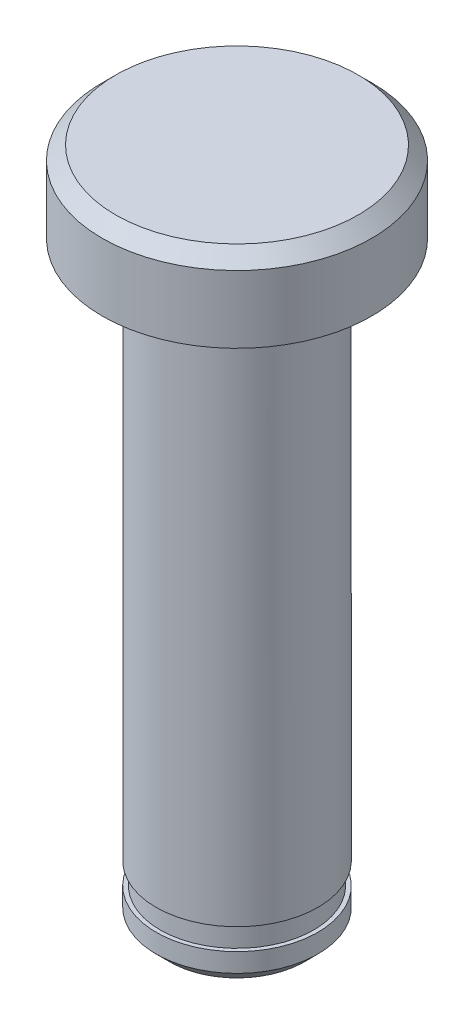
ISO-10303-21;
HEADER;
FILE_DESCRIPTION(('STEP AP214'),'2;1');
FILE_NAME('part.step','',(''),(''),'','','');
FILE_SCHEMA(('AUTOMOTIVE_DESIGN { 1 0 10303 214 1 1 1 1 }'));
ENDSEC;
DATA;
#1=APPLICATION_CONTEXT('core data for automotive mechanical design processes');
#2=APPLICATION_PROTOCOL_DEFINITION('international standard','automotive_design',2000,#1);
#3=PRODUCT_CONTEXT('',#1,'mechanical');
#4=PRODUCT('Part','Part','',(#3));
#5=PRODUCT_RELATED_PRODUCT_CATEGORY('part','',(#4));
#6=PRODUCT_DEFINITION_FORMATION('','',#4);
#7=PRODUCT_DEFINITION_CONTEXT('part definition',#1,'design');
#8=PRODUCT_DEFINITION('design','',#6,#7);
#9=PRODUCT_DEFINITION_SHAPE('','',#8);
#10=(LENGTH_UNIT() NAMED_UNIT(*) SI_UNIT(.MILLI.,.METRE.));
#11=(NAMED_UNIT(*) PLANE_ANGLE_UNIT() SI_UNIT($,.RADIAN.));
#12=(NAMED_UNIT(*) SI_UNIT($,.STERADIAN.) SOLID_ANGLE_UNIT());
#13=UNCERTAINTY_MEASURE_WITH_UNIT(LENGTH_MEASURE(1.E-05),#10,'distance_accuracy_value','');
#14=(GEOMETRIC_REPRESENTATION_CONTEXT(3) GLOBAL_UNCERTAINTY_ASSIGNED_CONTEXT((#13)) GLOBAL_UNIT_ASSIGNED_CONTEXT((#10,
#11,#12)) REPRESENTATION_CONTEXT('',''));
#15=CARTESIAN_POINT('',(0.,0.,0.));
#16=DIRECTION('',(0.,0.,1.));
#17=DIRECTION('',(1.,0.,0.));
#18=AXIS2_PLACEMENT_3D('',#15,#16,#17);
#19=CARTESIAN_POINT('',(0.,3.,0.));
#20=DIRECTION('',(0.,-1.,0.));
#21=DIRECTION('',(0.,0.,-1.));
#22=AXIS2_PLACEMENT_3D('',#19,#20,#21);
#23=CYLINDRICAL_SURFACE('',#22,5.);
#24=CARTESIAN_POINT('',(0.,2.5,0.));
#25=DIRECTION('',(0.,1.,0.));
#26=DIRECTION('',(0.,0.,1.));
#27=AXIS2_PLACEMENT_3D('',#24,#25,#26);
#28=CIRCLE('',#27,5.);
#29=CARTESIAN_POINT('',(0.,2.5,5.));
#30=VERTEX_POINT('',#29);
#31=EDGE_CURVE('E73',#30,#30,#28,.F.);
#32=ORIENTED_EDGE('',*,*,#31,.T.);
#33=EDGE_LOOP('',(#32));
#34=FACE_BOUND('',#33,.T.);
#35=CARTESIAN_POINT('',(0.,0.,0.));
#36=DIRECTION('',(0.,1.,0.));
#37=DIRECTION('',(0.,0.,1.));
#38=AXIS2_PLACEMENT_3D('',#35,#36,#37);
#39=CIRCLE('',#38,5.);
#40=CARTESIAN_POINT('',(0.,0.,5.));
#41=VERTEX_POINT('',#40);
#42=EDGE_CURVE('E62',#41,#41,#39,.T.);
#43=ORIENTED_EDGE('',*,*,#42,.T.);
#44=EDGE_LOOP('',(#43));
#45=FACE_BOUND('',#44,.T.);
#46=ADVANCED_FACE('F39',(#34,#45),#23,.T.);
#47=CARTESIAN_POINT('',(0.,3.,0.));
#48=DIRECTION('',(0.,1.,0.));
#49=DIRECTION('',(0.,0.,1.));
#50=AXIS2_PLACEMENT_3D('',#47,#48,#49);
#51=PLANE('',#50);
#52=CARTESIAN_POINT('',(0.,3.,0.));
#53=DIRECTION('',(0.,1.,0.));
#54=DIRECTION('',(0.,0.,1.));
#55=AXIS2_PLACEMENT_3D('',#52,#53,#54);
#56=CIRCLE('',#55,4.5);
#57=CARTESIAN_POINT('',(0.,3.,4.5));
#58=VERTEX_POINT('',#57);
#59=EDGE_CURVE('E76',#58,#58,#56,.T.);
#60=ORIENTED_EDGE('',*,*,#59,.T.);
#61=EDGE_LOOP('',(#60));
#62=FACE_BOUND('',#61,.T.);
#63=ADVANCED_FACE('F90',(#62),#51,.T.);
#64=CARTESIAN_POINT('',(0.,0.,0.));
#65=DIRECTION('',(0.,1.,0.));
#66=DIRECTION('',(0.,0.,1.));
#67=AXIS2_PLACEMENT_3D('',#64,#65,#66);
#68=PLANE('',#67);
#69=CARTESIAN_POINT('',(0.,0.,0.));
#70=DIRECTION('',(0.,-1.,0.));
#71=DIRECTION('',(0.,0.,-1.));
#72=AXIS2_PLACEMENT_3D('',#69,#70,#71);
#73=CIRCLE('',#72,3.);
#74=CARTESIAN_POINT('',(0.,0.,-3.));
#75=VERTEX_POINT('',#74);
#76=EDGE_CURVE('E53',#75,#75,#73,.T.);
#77=ORIENTED_EDGE('',*,*,#76,.F.);
#78=EDGE_LOOP('',(#77));
#79=FACE_BOUND('',#78,.T.);
#80=ORIENTED_EDGE('',*,*,#42,.F.);
#81=EDGE_LOOP('',(#80));
#82=FACE_BOUND('',#81,.T.);
#83=ADVANCED_FACE('F87',(#79,#82),#68,.F.);
#84=CARTESIAN_POINT('',(0.,3.,0.));
#85=DIRECTION('',(0.,-1.,0.));
#86=DIRECTION('',(0.,0.,-1.));
#87=AXIS2_PLACEMENT_3D('',#84,#85,#86);
#88=CONICAL_SURFACE('',#87,4.5,0.785398163397447);
#89=ORIENTED_EDGE('',*,*,#31,.F.);
#90=EDGE_LOOP('',(#89));
#91=FACE_BOUND('',#90,.T.);
#92=ORIENTED_EDGE('',*,*,#59,.F.);
#93=EDGE_LOOP('',(#92));
#94=FACE_BOUND('',#93,.T.);
#95=ADVANCED_FACE('F83',(#91,#94),#88,.T.);
#96=CARTESIAN_POINT('',(0.,-22.,0.));
#97=DIRECTION('',(0.,1.,0.));
#98=DIRECTION('',(0.,0.,1.));
#99=AXIS2_PLACEMENT_3D('',#96,#97,#98);
#100=CYLINDRICAL_SURFACE('',#99,3.);
#101=CARTESIAN_POINT('',(0.,-20.,0.));
#102=DIRECTION('',(0.,1.,0.));
#103=DIRECTION('',(0.,0.,1.));
#104=AXIS2_PLACEMENT_3D('',#101,#102,#103);
#105=CIRCLE('',#104,3.);
#106=CARTESIAN_POINT('',(0.,-20.,3.));
#107=VERTEX_POINT('',#106);
#108=EDGE_CURVE('E56',#107,#107,#105,.T.);
#109=ORIENTED_EDGE('',*,*,#108,.T.);
#110=EDGE_LOOP('',(#109));
#111=FACE_BOUND('',#110,.T.);
#112=ORIENTED_EDGE('',*,*,#76,.T.);
#113=EDGE_LOOP('',(#112));
#114=FACE_BOUND('',#113,.T.);
#115=ADVANCED_FACE('F86',(#111,#114),#100,.T.);
#116=CARTESIAN_POINT('',(0.,-20.8,3.));
#117=DIRECTION('',(0.,-1.,0.));
#118=DIRECTION('',(0.,0.,-1.));
#119=AXIS2_PLACEMENT_3D('',#116,#117,#118);
#120=PLANE('',#119);
#121=CARTESIAN_POINT('',(0.,-20.8,0.));
#122=DIRECTION('',(0.,1.,0.));
#123=DIRECTION('',(0.,0.,1.));
#124=AXIS2_PLACEMENT_3D('',#121,#122,#123);
#125=CIRCLE('',#124,2.85);
#126=CARTESIAN_POINT('',(0.,-20.8,2.85));
#127=VERTEX_POINT('',#126);
#128=EDGE_CURVE('E58',#127,#127,#125,.T.);
#129=ORIENTED_EDGE('',*,*,#128,.F.);
#130=EDGE_LOOP('',(#129));
#131=FACE_BOUND('',#130,.T.);
#132=CARTESIAN_POINT('',(0.,-20.8,0.));
#133=DIRECTION('',(0.,-1.,0.));
#134=DIRECTION('',(0.,0.,-1.));
#135=AXIS2_PLACEMENT_3D('',#132,#133,#134);
#136=CIRCLE('',#135,3.);
#137=CARTESIAN_POINT('',(0.,-20.8,-3.));
#138=VERTEX_POINT('',#137);
#139=EDGE_CURVE('E44',#138,#138,#136,.T.);
#140=ORIENTED_EDGE('',*,*,#139,.F.);
#141=EDGE_LOOP('',(#140));
#142=FACE_BOUND('',#141,.T.);
#143=ADVANCED_FACE('F108',(#131,#142),#120,.F.);
#144=CARTESIAN_POINT('',(0.,-20.,3.));
#145=DIRECTION('',(0.,1.,0.));
#146=DIRECTION('',(0.,0.,1.));
#147=AXIS2_PLACEMENT_3D('',#144,#145,#146);
#148=PLANE('',#147);
#149=CARTESIAN_POINT('',(0.,-20.,0.));
#150=DIRECTION('',(0.,1.,0.));
#151=DIRECTION('',(0.,0.,1.));
#152=AXIS2_PLACEMENT_3D('',#149,#150,#151);
#153=CIRCLE('',#152,2.85);
#154=CARTESIAN_POINT('',(0.,-20.,2.85));
#155=VERTEX_POINT('',#154);
#156=EDGE_CURVE('E64',#155,#155,#153,.T.);
#157=ORIENTED_EDGE('',*,*,#156,.T.);
#158=EDGE_LOOP('',(#157));
#159=FACE_BOUND('',#158,.T.);
#160=ORIENTED_EDGE('',*,*,#108,.F.);
#161=EDGE_LOOP('',(#160));
#162=FACE_BOUND('',#161,.T.);
#163=ADVANCED_FACE('F117',(#159,#162),#148,.F.);
#164=CARTESIAN_POINT('',(0.,0.,0.));
#165=DIRECTION('',(0.,1.,0.));
#166=DIRECTION('',(0.,0.,1.));
#167=AXIS2_PLACEMENT_3D('',#164,#165,#166);
#168=CYLINDRICAL_SURFACE('',#167,2.85);
#169=ORIENTED_EDGE('',*,*,#156,.F.);
#170=EDGE_LOOP('',(#169));
#171=FACE_BOUND('',#170,.T.);
#172=ORIENTED_EDGE('',*,*,#128,.T.);
#173=EDGE_LOOP('',(#172));
#174=FACE_BOUND('',#173,.T.);
#175=ADVANCED_FACE('F113',(#171,#174),#168,.T.);
#176=CARTESIAN_POINT('',(0.,-22.,0.));
#177=DIRECTION('',(0.,-1.,0.));
#178=DIRECTION('',(0.,0.,-1.));
#179=AXIS2_PLACEMENT_3D('',#176,#177,#178);
#180=PLANE('',#179);
#181=CARTESIAN_POINT('',(0.,-22.,0.));
#182=DIRECTION('',(0.,-1.,0.));
#183=DIRECTION('',(0.,0.,-1.));
#184=AXIS2_PLACEMENT_3D('',#181,#182,#183);
#185=CIRCLE('',#184,2.5);
#186=CARTESIAN_POINT('',(0.,-22.,-2.5));
#187=VERTEX_POINT('',#186);
#188=EDGE_CURVE('E48',#187,#187,#185,.T.);
#189=ORIENTED_EDGE('',*,*,#188,.T.);
#190=EDGE_LOOP('',(#189));
#191=FACE_BOUND('',#190,.T.);
#192=ADVANCED_FACE('F110',(#191),#180,.T.);
#193=CARTESIAN_POINT('',(0.,-22.,0.));
#194=DIRECTION('',(0.,1.,0.));
#195=DIRECTION('',(0.,0.,1.));
#196=AXIS2_PLACEMENT_3D('',#193,#194,#195);
#197=CONICAL_SURFACE('',#196,2.5,0.785398163397446);
#198=CARTESIAN_POINT('',(0.,-21.5,0.));
#199=DIRECTION('',(0.,-1.,0.));
#200=DIRECTION('',(0.,0.,-1.));
#201=AXIS2_PLACEMENT_3D('',#198,#199,#200);
#202=CIRCLE('',#201,3.);
#203=CARTESIAN_POINT('',(0.,-21.5,-3.));
#204=VERTEX_POINT('',#203);
#205=EDGE_CURVE('E10',#204,#204,#202,.F.);
#206=ORIENTED_EDGE('',*,*,#205,.F.);
#207=EDGE_LOOP('',(#206));
#208=FACE_BOUND('',#207,.T.);
#209=ORIENTED_EDGE('',*,*,#188,.F.);
#210=EDGE_LOOP('',(#209));
#211=FACE_BOUND('',#210,.T.);
#212=ADVANCED_FACE('F42',(#208,#211),#197,.T.);
#213=ORIENTED_EDGE('',*,*,#139,.T.);
#214=EDGE_LOOP('',(#213));
#215=FACE_BOUND('',#214,.T.);
#216=ORIENTED_EDGE('',*,*,#205,.T.);
#217=EDGE_LOOP('',(#216));
#218=FACE_BOUND('',#217,.T.);
#219=ADVANCED_FACE('F109',(#215,#218),#100,.T.);
#220=CLOSED_SHELL('',(#46,#63,#83,#95,#115,#143,#163,#175,#192,#212,#219));
#221=MANIFOLD_SOLID_BREP('B2',#220);
#222=ADVANCED_BREP_SHAPE_REPRESENTATION('',(#18,#221),#14);
#223=SHAPE_DEFINITION_REPRESENTATION(#9,#222);
ENDSEC;
END-ISO-10303-21;
